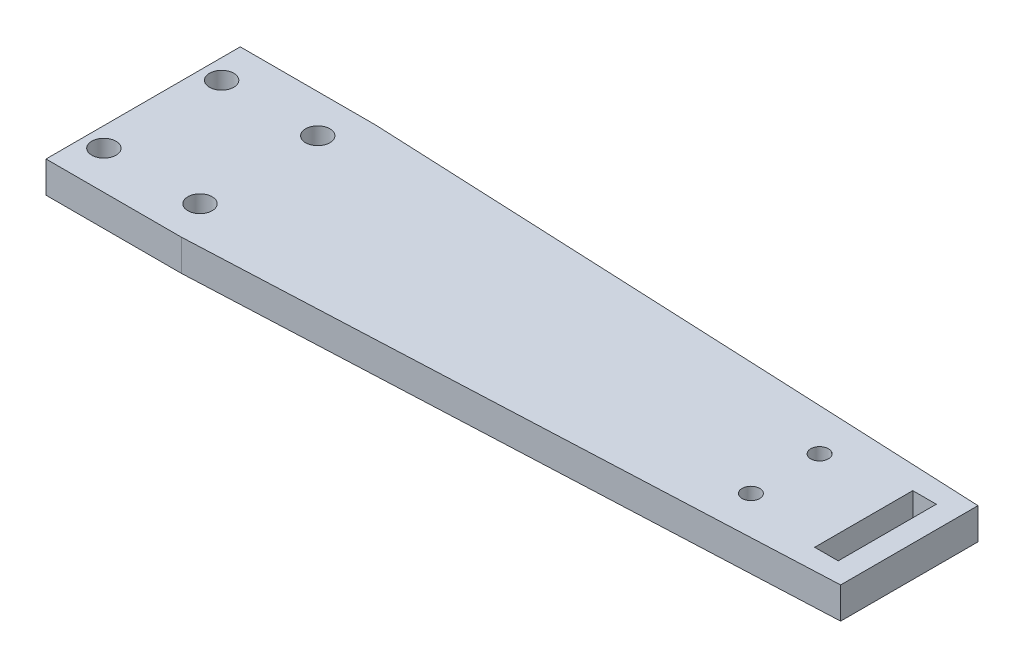
ISO-10303-21;
HEADER;
FILE_DESCRIPTION(('STEP AP214'),'2;1');
FILE_NAME('part.step','',(''),(''),'','','');
FILE_SCHEMA(('AUTOMOTIVE_DESIGN { 1 0 10303 214 1 1 1 1 }'));
ENDSEC;
DATA;
#1=APPLICATION_CONTEXT('core data for automotive mechanical design processes');
#2=APPLICATION_PROTOCOL_DEFINITION('international standard','automotive_design',2000,#1);
#3=PRODUCT_CONTEXT('',#1,'mechanical');
#4=PRODUCT('Part','Part','',(#3));
#5=PRODUCT_RELATED_PRODUCT_CATEGORY('part','',(#4));
#6=PRODUCT_DEFINITION_FORMATION('','',#4);
#7=PRODUCT_DEFINITION_CONTEXT('part definition',#1,'design');
#8=PRODUCT_DEFINITION('design','',#6,#7);
#9=PRODUCT_DEFINITION_SHAPE('','',#8);
#10=(LENGTH_UNIT() NAMED_UNIT(*) SI_UNIT(.MILLI.,.METRE.));
#11=(NAMED_UNIT(*) PLANE_ANGLE_UNIT() SI_UNIT($,.RADIAN.));
#12=(NAMED_UNIT(*) SI_UNIT($,.STERADIAN.) SOLID_ANGLE_UNIT());
#13=UNCERTAINTY_MEASURE_WITH_UNIT(LENGTH_MEASURE(1.E-05),#10,'distance_accuracy_value','');
#14=(GEOMETRIC_REPRESENTATION_CONTEXT(3) GLOBAL_UNCERTAINTY_ASSIGNED_CONTEXT((#13)) GLOBAL_UNIT_ASSIGNED_CONTEXT((#10,
#11,#12)) REPRESENTATION_CONTEXT('',''));
#15=CARTESIAN_POINT('',(0.,0.,0.));
#16=DIRECTION('',(0.,0.,1.));
#17=DIRECTION('',(1.,0.,0.));
#18=AXIS2_PLACEMENT_3D('',#15,#16,#17);
#19=CARTESIAN_POINT('',(0.,8.,0.));
#20=DIRECTION('',(1.,0.,0.));
#21=DIRECTION('',(0.,0.,-1.));
#22=AXIS2_PLACEMENT_3D('',#19,#20,#21);
#23=PLANE('',#22);
#24=DIRECTION('',(0.,0.,1.));
#25=VECTOR('',#24,1.);
#26=CARTESIAN_POINT('',(0.,0.,0.));
#27=LINE('',#26,#25);
#28=CARTESIAN_POINT('',(0.,0.,-49.5));
#29=VERTEX_POINT('',#28);
#30=CARTESIAN_POINT('',(0.,0.,0.));
#31=VERTEX_POINT('',#30);
#32=EDGE_CURVE('E241',#29,#31,#27,.T.);
#33=ORIENTED_EDGE('',*,*,#32,.T.);
#34=DIRECTION('',(0.,-1.,0.));
#35=VECTOR('',#34,1.);
#36=CARTESIAN_POINT('',(0.,8.,0.));
#37=LINE('',#36,#35);
#38=CARTESIAN_POINT('',(0.,8.,0.));
#39=VERTEX_POINT('',#38);
#40=EDGE_CURVE('E11',#39,#31,#37,.T.);
#41=ORIENTED_EDGE('',*,*,#40,.F.);
#42=DIRECTION('',(0.,0.,1.));
#43=VECTOR('',#42,1.);
#44=CARTESIAN_POINT('',(0.,8.,0.));
#45=LINE('',#44,#43);
#46=CARTESIAN_POINT('',(0.,8.,-49.5));
#47=VERTEX_POINT('',#46);
#48=EDGE_CURVE('E245',#47,#39,#45,.T.);
#49=ORIENTED_EDGE('',*,*,#48,.F.);
#50=DIRECTION('',(0.,-1.,0.));
#51=VECTOR('',#50,1.);
#52=CARTESIAN_POINT('',(0.,8.,-49.5));
#53=LINE('',#52,#51);
#54=EDGE_CURVE('E252',#47,#29,#53,.T.);
#55=ORIENTED_EDGE('',*,*,#54,.T.);
#56=EDGE_LOOP('',(#33,#41,#49,#55));
#57=FACE_BOUND('',#56,.T.);
#58=ADVANCED_FACE('F42',(#57),#23,.F.);
#59=CARTESIAN_POINT('',(0.,8.,0.));
#60=DIRECTION('',(0.,0.,-1.));
#61=DIRECTION('',(-1.,0.,0.));
#62=AXIS2_PLACEMENT_3D('',#59,#60,#61);
#63=PLANE('',#62);
#64=DIRECTION('',(1.,0.,0.));
#65=VECTOR('',#64,1.);
#66=CARTESIAN_POINT('',(0.,0.,0.));
#67=LINE('',#66,#65);
#68=CARTESIAN_POINT('',(34.5,0.,0.));
#69=VERTEX_POINT('',#68);
#70=EDGE_CURVE('E72',#31,#69,#67,.T.);
#71=ORIENTED_EDGE('',*,*,#70,.T.);
#72=DIRECTION('',(0.,-1.,0.));
#73=VECTOR('',#72,1.);
#74=CARTESIAN_POINT('',(34.5,8.,0.));
#75=LINE('',#74,#73);
#76=CARTESIAN_POINT('',(34.5,8.,0.));
#77=VERTEX_POINT('',#76);
#78=EDGE_CURVE('E51',#77,#69,#75,.T.);
#79=ORIENTED_EDGE('',*,*,#78,.F.);
#80=DIRECTION('',(1.,0.,0.));
#81=VECTOR('',#80,1.);
#82=CARTESIAN_POINT('',(0.,8.,0.));
#83=LINE('',#82,#81);
#84=EDGE_CURVE('E84',#39,#77,#83,.T.);
#85=ORIENTED_EDGE('',*,*,#84,.F.);
#86=ORIENTED_EDGE('',*,*,#40,.T.);
#87=EDGE_LOOP('',(#71,#79,#85,#86));
#88=FACE_BOUND('',#87,.T.);
#89=ADVANCED_FACE('F282',(#88),#63,.F.);
#90=CARTESIAN_POINT('',(0.,8.,-49.5));
#91=DIRECTION('',(0.,0.,1.));
#92=DIRECTION('',(1.,0.,0.));
#93=AXIS2_PLACEMENT_3D('',#90,#91,#92);
#94=PLANE('',#93);
#95=DIRECTION('',(-1.,0.,0.));
#96=VECTOR('',#95,1.);
#97=CARTESIAN_POINT('',(0.,0.,-49.5));
#98=LINE('',#97,#96);
#99=CARTESIAN_POINT('',(34.5,0.,-49.5));
#100=VERTEX_POINT('',#99);
#101=EDGE_CURVE('E79',#100,#29,#98,.T.);
#102=ORIENTED_EDGE('',*,*,#101,.T.);
#103=ORIENTED_EDGE('',*,*,#54,.F.);
#104=DIRECTION('',(-1.,0.,0.));
#105=VECTOR('',#104,1.);
#106=CARTESIAN_POINT('',(0.,8.,-49.5));
#107=LINE('',#106,#105);
#108=CARTESIAN_POINT('',(34.5,8.,-49.5));
#109=VERTEX_POINT('',#108);
#110=EDGE_CURVE('E59',#109,#47,#107,.T.);
#111=ORIENTED_EDGE('',*,*,#110,.F.);
#112=DIRECTION('',(0.,-1.,0.));
#113=VECTOR('',#112,1.);
#114=CARTESIAN_POINT('',(34.5,8.,-49.5));
#115=LINE('',#114,#113);
#116=EDGE_CURVE('E262',#109,#100,#115,.T.);
#117=ORIENTED_EDGE('',*,*,#116,.T.);
#118=EDGE_LOOP('',(#102,#103,#111,#117));
#119=FACE_BOUND('',#118,.T.);
#120=ADVANCED_FACE('F284',(#119),#94,.F.);
#121=CARTESIAN_POINT('',(0.,8.,0.));
#122=DIRECTION('',(0.,-1.,0.));
#123=DIRECTION('',(0.,0.,-1.));
#124=AXIS2_PLACEMENT_3D('',#121,#122,#123);
#125=PLANE('',#124);
#126=CARTESIAN_POINT('',(163.63,8.,-33.5000000000001));
#127=DIRECTION('',(0.,1.,0.));
#128=DIRECTION('',(0.,0.,1.));
#129=AXIS2_PLACEMENT_3D('',#126,#127,#128);
#130=CIRCLE('',#129,2.25000000000001);
#131=CARTESIAN_POINT('',(163.63,8.,-31.2500000000001));
#132=VERTEX_POINT('',#131);
#133=EDGE_CURVE('E347',#132,#132,#130,.T.);
#134=ORIENTED_EDGE('',*,*,#133,.F.);
#135=EDGE_LOOP('',(#134));
#136=FACE_BOUND('',#135,.T.);
#137=CARTESIAN_POINT('',(163.63,8.,-16.0000000000001));
#138=DIRECTION('',(0.,1.,0.));
#139=DIRECTION('',(0.,0.,1.));
#140=AXIS2_PLACEMENT_3D('',#137,#138,#139);
#141=CIRCLE('',#140,2.25000000000001);
#142=CARTESIAN_POINT('',(163.63,8.,-13.7500000000001));
#143=VERTEX_POINT('',#142);
#144=EDGE_CURVE('E349',#143,#143,#141,.T.);
#145=ORIENTED_EDGE('',*,*,#144,.F.);
#146=EDGE_LOOP('',(#145));
#147=FACE_BOUND('',#146,.T.);
#148=CARTESIAN_POINT('',(29.5,8.,-39.75));
#149=DIRECTION('',(0.,1.,0.));
#150=DIRECTION('',(0.,0.,-1.));
#151=AXIS2_PLACEMENT_3D('',#148,#149,#150);
#152=CIRCLE('',#151,3.1);
#153=CARTESIAN_POINT('',(29.5,8.,-42.85));
#154=VERTEX_POINT('',#153);
#155=EDGE_CURVE('E230',#154,#154,#152,.T.);
#156=ORIENTED_EDGE('',*,*,#155,.F.);
#157=EDGE_LOOP('',(#156));
#158=FACE_BOUND('',#157,.T.);
#159=CARTESIAN_POINT('',(29.5,8.,-9.75));
#160=DIRECTION('',(0.,1.,0.));
#161=DIRECTION('',(0.,0.,1.));
#162=AXIS2_PLACEMENT_3D('',#159,#160,#161);
#163=CIRCLE('',#162,3.1);
#164=CARTESIAN_POINT('',(29.5,8.,-6.65));
#165=VERTEX_POINT('',#164);
#166=EDGE_CURVE('E222',#165,#165,#163,.T.);
#167=ORIENTED_EDGE('',*,*,#166,.F.);
#168=EDGE_LOOP('',(#167));
#169=FACE_BOUND('',#168,.T.);
#170=CARTESIAN_POINT('',(5.,8.,-9.75));
#171=DIRECTION('',(0.,1.,0.));
#172=DIRECTION('',(0.,0.,-1.));
#173=AXIS2_PLACEMENT_3D('',#170,#171,#172);
#174=CIRCLE('',#173,3.1);
#175=CARTESIAN_POINT('',(5.,8.,-12.85));
#176=VERTEX_POINT('',#175);
#177=EDGE_CURVE('E213',#176,#176,#174,.T.);
#178=ORIENTED_EDGE('',*,*,#177,.F.);
#179=EDGE_LOOP('',(#178));
#180=FACE_BOUND('',#179,.T.);
#181=CARTESIAN_POINT('',(5.,8.,-39.75));
#182=DIRECTION('',(0.,1.,0.));
#183=DIRECTION('',(0.,0.,1.));
#184=AXIS2_PLACEMENT_3D('',#181,#182,#183);
#185=CIRCLE('',#184,3.1);
#186=CARTESIAN_POINT('',(5.,8.,-36.65));
#187=VERTEX_POINT('',#186);
#188=EDGE_CURVE('E217',#187,#187,#185,.T.);
#189=ORIENTED_EDGE('',*,*,#188,.F.);
#190=EDGE_LOOP('',(#189));
#191=FACE_BOUND('',#190,.T.);
#192=ORIENTED_EDGE('',*,*,#48,.T.);
#193=ORIENTED_EDGE('',*,*,#84,.T.);
#194=DIRECTION('',(0.998984494874561,0.,-0.0450552882602835));
#195=VECTOR('',#194,1.);
#196=CARTESIAN_POINT('',(195.25,8.,-7.25));
#197=LINE('',#196,#195);
#198=CARTESIAN_POINT('',(195.25,8.,-7.25));
#199=VERTEX_POINT('',#198);
#200=EDGE_CURVE('E189',#77,#199,#197,.T.);
#201=ORIENTED_EDGE('',*,*,#200,.T.);
#202=DIRECTION('',(0.,0.,-1.));
#203=VECTOR('',#202,1.);
#204=CARTESIAN_POINT('',(195.25,8.,-42.25));
#205=LINE('',#204,#203);
#206=CARTESIAN_POINT('',(195.25,8.,-42.25));
#207=VERTEX_POINT('',#206);
#208=EDGE_CURVE('E178',#199,#207,#205,.T.);
#209=ORIENTED_EDGE('',*,*,#208,.T.);
#210=DIRECTION('',(-0.998984494874561,0.,-0.0450552882602835));
#211=VECTOR('',#210,1.);
#212=CARTESIAN_POINT('',(195.25,8.,-42.25));
#213=LINE('',#212,#211);
#214=EDGE_CURVE('E201',#207,#109,#213,.T.);
#215=ORIENTED_EDGE('',*,*,#214,.T.);
#216=ORIENTED_EDGE('',*,*,#110,.T.);
#217=EDGE_LOOP('',(#192,#193,#201,#209,#215,#216));
#218=FACE_BOUND('',#217,.T.);
#219=DIRECTION('',(1.,0.,0.));
#220=VECTOR('',#219,1.);
#221=CARTESIAN_POINT('',(183.63,8.,-12.25));
#222=LINE('',#221,#220);
#223=CARTESIAN_POINT('',(183.63,8.,-12.25));
#224=VERTEX_POINT('',#223);
#225=CARTESIAN_POINT('',(189.63,8.,-12.25));
#226=VERTEX_POINT('',#225);
#227=EDGE_CURVE('E168',#224,#226,#222,.T.);
#228=ORIENTED_EDGE('',*,*,#227,.F.);
#229=DIRECTION('',(0.,0.,1.));
#230=VECTOR('',#229,1.);
#231=CARTESIAN_POINT('',(183.63,8.,-37.2500000000002));
#232=LINE('',#231,#230);
#233=CARTESIAN_POINT('',(183.63,8.,-37.2500000000002));
#234=VERTEX_POINT('',#233);
#235=EDGE_CURVE('E132',#234,#224,#232,.T.);
#236=ORIENTED_EDGE('',*,*,#235,.F.);
#237=DIRECTION('',(-1.,0.,0.));
#238=VECTOR('',#237,1.);
#239=CARTESIAN_POINT('',(183.63,8.,-37.2500000000002));
#240=LINE('',#239,#238);
#241=CARTESIAN_POINT('',(189.63,8.,-37.2500000000002));
#242=VERTEX_POINT('',#241);
#243=EDGE_CURVE('E152',#242,#234,#240,.T.);
#244=ORIENTED_EDGE('',*,*,#243,.F.);
#245=DIRECTION('',(0.,0.,-1.));
#246=VECTOR('',#245,1.);
#247=CARTESIAN_POINT('',(189.63,8.,-37.2500000000002));
#248=LINE('',#247,#246);
#249=EDGE_CURVE('E156',#226,#242,#248,.T.);
#250=ORIENTED_EDGE('',*,*,#249,.F.);
#251=EDGE_LOOP('',(#228,#236,#244,#250));
#252=FACE_BOUND('',#251,.T.);
#253=ADVANCED_FACE('F277',(#136,#147,#158,#169,#180,#191,#218,#252),#125,.F.);
#254=CARTESIAN_POINT('',(0.,0.,0.));
#255=DIRECTION('',(0.,-1.,0.));
#256=DIRECTION('',(0.,0.,-1.));
#257=AXIS2_PLACEMENT_3D('',#254,#255,#256);
#258=PLANE('',#257);
#259=CARTESIAN_POINT('',(163.63,0.,-33.5000000000001));
#260=DIRECTION('',(0.,1.,0.));
#261=DIRECTION('',(0.,0.,1.));
#262=AXIS2_PLACEMENT_3D('',#259,#260,#261);
#263=CIRCLE('',#262,2.25000000000001);
#264=CARTESIAN_POINT('',(163.63,0.,-31.2500000000001));
#265=VERTEX_POINT('',#264);
#266=EDGE_CURVE('E169',#265,#265,#263,.T.);
#267=ORIENTED_EDGE('',*,*,#266,.T.);
#268=EDGE_LOOP('',(#267));
#269=FACE_BOUND('',#268,.T.);
#270=CARTESIAN_POINT('',(163.63,0.,-16.0000000000001));
#271=DIRECTION('',(0.,1.,0.));
#272=DIRECTION('',(0.,0.,1.));
#273=AXIS2_PLACEMENT_3D('',#270,#271,#272);
#274=CIRCLE('',#273,2.25000000000001);
#275=CARTESIAN_POINT('',(163.63,0.,-13.7500000000001));
#276=VERTEX_POINT('',#275);
#277=EDGE_CURVE('E159',#276,#276,#274,.T.);
#278=ORIENTED_EDGE('',*,*,#277,.T.);
#279=EDGE_LOOP('',(#278));
#280=FACE_BOUND('',#279,.T.);
#281=CARTESIAN_POINT('',(29.5,0.,-39.75));
#282=DIRECTION('',(0.,1.,0.));
#283=DIRECTION('',(0.,0.,-1.));
#284=AXIS2_PLACEMENT_3D('',#281,#282,#283);
#285=CIRCLE('',#284,3.1);
#286=CARTESIAN_POINT('',(29.5,0.,-42.85));
#287=VERTEX_POINT('',#286);
#288=EDGE_CURVE('E210',#287,#287,#285,.T.);
#289=ORIENTED_EDGE('',*,*,#288,.T.);
#290=EDGE_LOOP('',(#289));
#291=FACE_BOUND('',#290,.T.);
#292=CARTESIAN_POINT('',(29.5,0.,-9.75));
#293=DIRECTION('',(0.,1.,0.));
#294=DIRECTION('',(0.,0.,1.));
#295=AXIS2_PLACEMENT_3D('',#292,#293,#294);
#296=CIRCLE('',#295,3.1);
#297=CARTESIAN_POINT('',(29.5,0.,-6.65));
#298=VERTEX_POINT('',#297);
#299=EDGE_CURVE('E226',#298,#298,#296,.T.);
#300=ORIENTED_EDGE('',*,*,#299,.T.);
#301=EDGE_LOOP('',(#300));
#302=FACE_BOUND('',#301,.T.);
#303=CARTESIAN_POINT('',(5.,0.,-9.75));
#304=DIRECTION('',(0.,1.,0.));
#305=DIRECTION('',(0.,0.,-1.));
#306=AXIS2_PLACEMENT_3D('',#303,#304,#305);
#307=CIRCLE('',#306,3.1);
#308=CARTESIAN_POINT('',(5.,0.,-12.85));
#309=VERTEX_POINT('',#308);
#310=EDGE_CURVE('E218',#309,#309,#307,.T.);
#311=ORIENTED_EDGE('',*,*,#310,.T.);
#312=EDGE_LOOP('',(#311));
#313=FACE_BOUND('',#312,.T.);
#314=CARTESIAN_POINT('',(5.,0.,-39.75));
#315=DIRECTION('',(0.,1.,0.));
#316=DIRECTION('',(0.,0.,1.));
#317=AXIS2_PLACEMENT_3D('',#314,#315,#316);
#318=CIRCLE('',#317,3.1);
#319=CARTESIAN_POINT('',(5.,0.,-36.65));
#320=VERTEX_POINT('',#319);
#321=EDGE_CURVE('E237',#320,#320,#318,.T.);
#322=ORIENTED_EDGE('',*,*,#321,.T.);
#323=EDGE_LOOP('',(#322));
#324=FACE_BOUND('',#323,.T.);
#325=ORIENTED_EDGE('',*,*,#32,.F.);
#326=ORIENTED_EDGE('',*,*,#101,.F.);
#327=DIRECTION('',(-0.998984494874561,0.,-0.0450552882602835));
#328=VECTOR('',#327,1.);
#329=CARTESIAN_POINT('',(195.25,0.,-42.25));
#330=LINE('',#329,#328);
#331=CARTESIAN_POINT('',(195.25,0.,-42.25));
#332=VERTEX_POINT('',#331);
#333=EDGE_CURVE('E188',#332,#100,#330,.T.);
#334=ORIENTED_EDGE('',*,*,#333,.F.);
#335=DIRECTION('',(0.,0.,-1.));
#336=VECTOR('',#335,1.);
#337=CARTESIAN_POINT('',(195.25,0.,-42.25));
#338=LINE('',#337,#336);
#339=CARTESIAN_POINT('',(195.25,0.,-7.25));
#340=VERTEX_POINT('',#339);
#341=EDGE_CURVE('E184',#340,#332,#338,.T.);
#342=ORIENTED_EDGE('',*,*,#341,.F.);
#343=DIRECTION('',(0.998984494874561,0.,-0.0450552882602835));
#344=VECTOR('',#343,1.);
#345=CARTESIAN_POINT('',(195.25,0.,-7.25));
#346=LINE('',#345,#344);
#347=EDGE_CURVE('E193',#69,#340,#346,.T.);
#348=ORIENTED_EDGE('',*,*,#347,.F.);
#349=ORIENTED_EDGE('',*,*,#70,.F.);
#350=EDGE_LOOP('',(#325,#326,#334,#342,#348,#349));
#351=FACE_BOUND('',#350,.T.);
#352=DIRECTION('',(0.,0.,1.));
#353=VECTOR('',#352,1.);
#354=CARTESIAN_POINT('',(183.63,0.,-37.2500000000002));
#355=LINE('',#354,#353);
#356=CARTESIAN_POINT('',(183.63,0.,-37.2500000000002));
#357=VERTEX_POINT('',#356);
#358=CARTESIAN_POINT('',(183.63,0.,-12.25));
#359=VERTEX_POINT('',#358);
#360=EDGE_CURVE('E129',#357,#359,#355,.T.);
#361=ORIENTED_EDGE('',*,*,#360,.T.);
#362=DIRECTION('',(1.,0.,0.));
#363=VECTOR('',#362,1.);
#364=CARTESIAN_POINT('',(183.63,0.,-12.25));
#365=LINE('',#364,#363);
#366=CARTESIAN_POINT('',(189.63,0.,-12.25));
#367=VERTEX_POINT('',#366);
#368=EDGE_CURVE('E142',#359,#367,#365,.T.);
#369=ORIENTED_EDGE('',*,*,#368,.T.);
#370=DIRECTION('',(0.,0.,-1.));
#371=VECTOR('',#370,1.);
#372=CARTESIAN_POINT('',(189.63,0.,-37.2500000000002));
#373=LINE('',#372,#371);
#374=CARTESIAN_POINT('',(189.63,0.,-37.2500000000002));
#375=VERTEX_POINT('',#374);
#376=EDGE_CURVE('E147',#367,#375,#373,.T.);
#377=ORIENTED_EDGE('',*,*,#376,.T.);
#378=DIRECTION('',(-1.,0.,0.));
#379=VECTOR('',#378,1.);
#380=CARTESIAN_POINT('',(183.63,0.,-37.2500000000002));
#381=LINE('',#380,#379);
#382=EDGE_CURVE('E138',#375,#357,#381,.T.);
#383=ORIENTED_EDGE('',*,*,#382,.T.);
#384=EDGE_LOOP('',(#361,#369,#377,#383));
#385=FACE_BOUND('',#384,.T.);
#386=ADVANCED_FACE('F149',(#269,#280,#291,#302,#313,#324,#351,#385),#258,.T.);
#387=CARTESIAN_POINT('',(5.,0.,-39.75));
#388=DIRECTION('',(0.,1.,0.));
#389=DIRECTION('',(0.,0.,1.));
#390=AXIS2_PLACEMENT_3D('',#387,#388,#389);
#391=CYLINDRICAL_SURFACE('',#390,3.1);
#392=ORIENTED_EDGE('',*,*,#321,.F.);
#393=EDGE_LOOP('',(#392));
#394=FACE_BOUND('',#393,.T.);
#395=ORIENTED_EDGE('',*,*,#188,.T.);
#396=EDGE_LOOP('',(#395));
#397=FACE_BOUND('',#396,.T.);
#398=ADVANCED_FACE('F293',(#394,#397),#391,.F.);
#399=CARTESIAN_POINT('',(5.,0.,-9.75));
#400=DIRECTION('',(0.,1.,0.));
#401=DIRECTION('',(0.,0.,1.));
#402=AXIS2_PLACEMENT_3D('',#399,#400,#401);
#403=CYLINDRICAL_SURFACE('',#402,3.1);
#404=ORIENTED_EDGE('',*,*,#310,.F.);
#405=EDGE_LOOP('',(#404));
#406=FACE_BOUND('',#405,.T.);
#407=ORIENTED_EDGE('',*,*,#177,.T.);
#408=EDGE_LOOP('',(#407));
#409=FACE_BOUND('',#408,.T.);
#410=ADVANCED_FACE('F300',(#406,#409),#403,.F.);
#411=CARTESIAN_POINT('',(29.5,0.,-9.75));
#412=DIRECTION('',(0.,1.,0.));
#413=DIRECTION('',(0.,0.,1.));
#414=AXIS2_PLACEMENT_3D('',#411,#412,#413);
#415=CYLINDRICAL_SURFACE('',#414,3.1);
#416=ORIENTED_EDGE('',*,*,#299,.F.);
#417=EDGE_LOOP('',(#416));
#418=FACE_BOUND('',#417,.T.);
#419=ORIENTED_EDGE('',*,*,#166,.T.);
#420=EDGE_LOOP('',(#419));
#421=FACE_BOUND('',#420,.T.);
#422=ADVANCED_FACE('F305',(#418,#421),#415,.F.);
#423=CARTESIAN_POINT('',(29.5,0.,-39.75));
#424=DIRECTION('',(0.,1.,0.));
#425=DIRECTION('',(0.,0.,1.));
#426=AXIS2_PLACEMENT_3D('',#423,#424,#425);
#427=CYLINDRICAL_SURFACE('',#426,3.1);
#428=ORIENTED_EDGE('',*,*,#288,.F.);
#429=EDGE_LOOP('',(#428));
#430=FACE_BOUND('',#429,.T.);
#431=ORIENTED_EDGE('',*,*,#155,.T.);
#432=EDGE_LOOP('',(#431));
#433=FACE_BOUND('',#432,.T.);
#434=ADVANCED_FACE('F302',(#430,#433),#427,.F.);
#435=CARTESIAN_POINT('',(195.25,0.,-42.25));
#436=DIRECTION('',(1.,0.,0.));
#437=DIRECTION('',(0.,0.,-1.));
#438=AXIS2_PLACEMENT_3D('',#435,#436,#437);
#439=PLANE('',#438);
#440=ORIENTED_EDGE('',*,*,#208,.F.);
#441=DIRECTION('',(0.,1.,0.));
#442=VECTOR('',#441,1.);
#443=CARTESIAN_POINT('',(195.25,0.,-7.25));
#444=LINE('',#443,#442);
#445=EDGE_CURVE('E207',#340,#199,#444,.T.);
#446=ORIENTED_EDGE('',*,*,#445,.F.);
#447=ORIENTED_EDGE('',*,*,#341,.T.);
#448=DIRECTION('',(0.,1.,0.));
#449=VECTOR('',#448,1.);
#450=CARTESIAN_POINT('',(195.25,0.,-42.25));
#451=LINE('',#450,#449);
#452=EDGE_CURVE('E197',#332,#207,#451,.T.);
#453=ORIENTED_EDGE('',*,*,#452,.T.);
#454=EDGE_LOOP('',(#440,#446,#447,#453));
#455=FACE_BOUND('',#454,.T.);
#456=ADVANCED_FACE('F275',(#455),#439,.T.);
#457=CARTESIAN_POINT('',(195.25,0.,-7.25));
#458=DIRECTION('',(0.0450552882602835,0.,0.998984494874562));
#459=DIRECTION('',(0.998984494874562,0.,-0.0450552882602835));
#460=AXIS2_PLACEMENT_3D('',#457,#458,#459);
#461=PLANE('',#460);
#462=ORIENTED_EDGE('',*,*,#200,.F.);
#463=ORIENTED_EDGE('',*,*,#78,.T.);
#464=ORIENTED_EDGE('',*,*,#347,.T.);
#465=ORIENTED_EDGE('',*,*,#445,.T.);
#466=EDGE_LOOP('',(#462,#463,#464,#465));
#467=FACE_BOUND('',#466,.T.);
#468=ADVANCED_FACE('F268',(#467),#461,.T.);
#469=CARTESIAN_POINT('',(195.25,0.,-42.25));
#470=DIRECTION('',(0.0450552882602835,0.,-0.998984494874562));
#471=DIRECTION('',(-0.998984494874562,0.,-0.0450552882602835));
#472=AXIS2_PLACEMENT_3D('',#469,#470,#471);
#473=PLANE('',#472);
#474=ORIENTED_EDGE('',*,*,#214,.F.);
#475=ORIENTED_EDGE('',*,*,#452,.F.);
#476=ORIENTED_EDGE('',*,*,#333,.T.);
#477=ORIENTED_EDGE('',*,*,#116,.F.);
#478=EDGE_LOOP('',(#474,#475,#476,#477));
#479=FACE_BOUND('',#478,.T.);
#480=ADVANCED_FACE('F315',(#479),#473,.T.);
#481=CARTESIAN_POINT('',(183.63,0.,-37.2500000000002));
#482=DIRECTION('',(-1.,0.,0.));
#483=DIRECTION('',(0.,0.,1.));
#484=AXIS2_PLACEMENT_3D('',#481,#482,#483);
#485=PLANE('',#484);
#486=ORIENTED_EDGE('',*,*,#235,.T.);
#487=DIRECTION('',(0.,1.,0.));
#488=VECTOR('',#487,1.);
#489=CARTESIAN_POINT('',(183.63,0.,-12.25));
#490=LINE('',#489,#488);
#491=EDGE_CURVE('E125',#359,#224,#490,.T.);
#492=ORIENTED_EDGE('',*,*,#491,.F.);
#493=ORIENTED_EDGE('',*,*,#360,.F.);
#494=DIRECTION('',(0.,1.,0.));
#495=VECTOR('',#494,1.);
#496=CARTESIAN_POINT('',(183.63,0.,-37.2500000000002));
#497=LINE('',#496,#495);
#498=EDGE_CURVE('E175',#357,#234,#497,.T.);
#499=ORIENTED_EDGE('',*,*,#498,.T.);
#500=EDGE_LOOP('',(#486,#492,#493,#499));
#501=FACE_BOUND('',#500,.T.);
#502=ADVANCED_FACE('F127',(#501),#485,.F.);
#503=CARTESIAN_POINT('',(183.63,0.,-37.2500000000002));
#504=DIRECTION('',(0.,0.,-1.));
#505=DIRECTION('',(-1.,0.,0.));
#506=AXIS2_PLACEMENT_3D('',#503,#504,#505);
#507=PLANE('',#506);
#508=ORIENTED_EDGE('',*,*,#243,.T.);
#509=ORIENTED_EDGE('',*,*,#498,.F.);
#510=ORIENTED_EDGE('',*,*,#382,.F.);
#511=DIRECTION('',(0.,1.,0.));
#512=VECTOR('',#511,1.);
#513=CARTESIAN_POINT('',(189.63,0.,-37.2500000000002));
#514=LINE('',#513,#512);
#515=EDGE_CURVE('E179',#375,#242,#514,.T.);
#516=ORIENTED_EDGE('',*,*,#515,.T.);
#517=EDGE_LOOP('',(#508,#509,#510,#516));
#518=FACE_BOUND('',#517,.T.);
#519=ADVANCED_FACE('F323',(#518),#507,.F.);
#520=CARTESIAN_POINT('',(189.63,0.,-37.2500000000002));
#521=DIRECTION('',(1.,0.,0.));
#522=DIRECTION('',(0.,0.,-1.));
#523=AXIS2_PLACEMENT_3D('',#520,#521,#522);
#524=PLANE('',#523);
#525=ORIENTED_EDGE('',*,*,#249,.T.);
#526=ORIENTED_EDGE('',*,*,#515,.F.);
#527=ORIENTED_EDGE('',*,*,#376,.F.);
#528=DIRECTION('',(0.,1.,0.));
#529=VECTOR('',#528,1.);
#530=CARTESIAN_POINT('',(189.63,0.,-12.25));
#531=LINE('',#530,#529);
#532=EDGE_CURVE('E137',#367,#226,#531,.T.);
#533=ORIENTED_EDGE('',*,*,#532,.T.);
#534=EDGE_LOOP('',(#525,#526,#527,#533));
#535=FACE_BOUND('',#534,.T.);
#536=ADVANCED_FACE('F327',(#535),#524,.F.);
#537=CARTESIAN_POINT('',(183.63,0.,-12.25));
#538=DIRECTION('',(0.,0.,1.));
#539=DIRECTION('',(1.,0.,0.));
#540=AXIS2_PLACEMENT_3D('',#537,#538,#539);
#541=PLANE('',#540);
#542=ORIENTED_EDGE('',*,*,#227,.T.);
#543=ORIENTED_EDGE('',*,*,#532,.F.);
#544=ORIENTED_EDGE('',*,*,#368,.F.);
#545=ORIENTED_EDGE('',*,*,#491,.T.);
#546=EDGE_LOOP('',(#542,#543,#544,#545));
#547=FACE_BOUND('',#546,.T.);
#548=ADVANCED_FACE('F143',(#547),#541,.F.);
#549=CARTESIAN_POINT('',(163.63,0.,-16.0000000000001));
#550=DIRECTION('',(0.,1.,0.));
#551=DIRECTION('',(0.,0.,1.));
#552=AXIS2_PLACEMENT_3D('',#549,#550,#551);
#553=CYLINDRICAL_SURFACE('',#552,2.25000000000001);
#554=ORIENTED_EDGE('',*,*,#277,.F.);
#555=EDGE_LOOP('',(#554));
#556=FACE_BOUND('',#555,.T.);
#557=ORIENTED_EDGE('',*,*,#144,.T.);
#558=EDGE_LOOP('',(#557));
#559=FACE_BOUND('',#558,.T.);
#560=ADVANCED_FACE('F326',(#556,#559),#553,.F.);
#561=CARTESIAN_POINT('',(163.63,0.,-33.5000000000001));
#562=DIRECTION('',(0.,1.,0.));
#563=DIRECTION('',(0.,0.,1.));
#564=AXIS2_PLACEMENT_3D('',#561,#562,#563);
#565=CYLINDRICAL_SURFACE('',#564,2.25000000000001);
#566=ORIENTED_EDGE('',*,*,#266,.F.);
#567=EDGE_LOOP('',(#566));
#568=FACE_BOUND('',#567,.T.);
#569=ORIENTED_EDGE('',*,*,#133,.T.);
#570=EDGE_LOOP('',(#569));
#571=FACE_BOUND('',#570,.T.);
#572=ADVANCED_FACE('F336',(#568,#571),#565,.F.);
#573=CLOSED_SHELL('',(#58,#89,#120,#253,#386,#398,#410,#422,#434,#456,#468,#480,#502,#519,#536,
#548,#560,#572));
#574=MANIFOLD_SOLID_BREP('B2',#573);
#575=ADVANCED_BREP_SHAPE_REPRESENTATION('',(#18,#574),#14);
#576=SHAPE_DEFINITION_REPRESENTATION(#9,#575);
ENDSEC;
END-ISO-10303-21;
